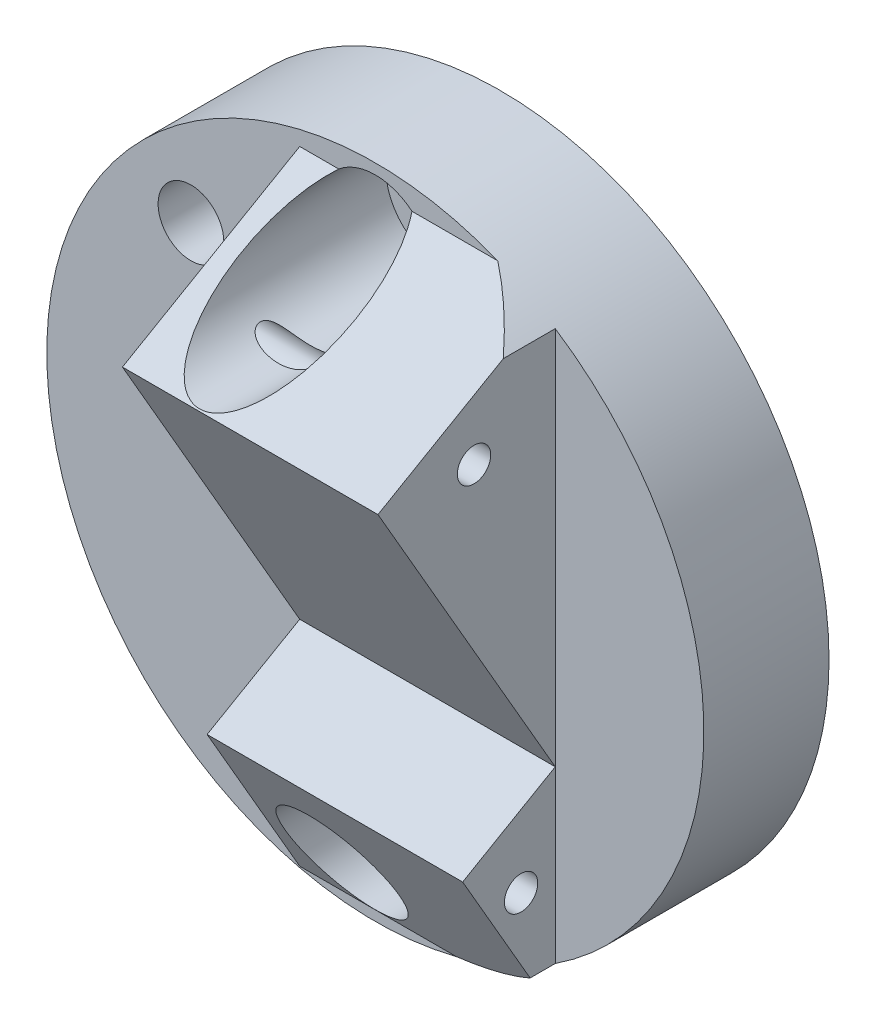
ISO-10303-21;
HEADER;
FILE_DESCRIPTION(('STEP AP214'),'2;1');
FILE_NAME('part.step','',(''),(''),'','','');
FILE_SCHEMA(('AUTOMOTIVE_DESIGN { 1 0 10303 214 1 1 1 1 }'));
ENDSEC;
DATA;
#1=APPLICATION_CONTEXT('core data for automotive mechanical design processes');
#2=APPLICATION_PROTOCOL_DEFINITION('international standard','automotive_design',2000,#1);
#3=PRODUCT_CONTEXT('',#1,'mechanical');
#4=PRODUCT('Part','Part','',(#3));
#5=PRODUCT_RELATED_PRODUCT_CATEGORY('part','',(#4));
#6=PRODUCT_DEFINITION_FORMATION('','',#4);
#7=PRODUCT_DEFINITION_CONTEXT('part definition',#1,'design');
#8=PRODUCT_DEFINITION('design','',#6,#7);
#9=PRODUCT_DEFINITION_SHAPE('','',#8);
#10=(LENGTH_UNIT() NAMED_UNIT(*) SI_UNIT(.MILLI.,.METRE.));
#11=(NAMED_UNIT(*) PLANE_ANGLE_UNIT() SI_UNIT($,.RADIAN.));
#12=(NAMED_UNIT(*) SI_UNIT($,.STERADIAN.) SOLID_ANGLE_UNIT());
#13=UNCERTAINTY_MEASURE_WITH_UNIT(LENGTH_MEASURE(1.E-05),#10,'distance_accuracy_value','');
#14=(GEOMETRIC_REPRESENTATION_CONTEXT(3) GLOBAL_UNCERTAINTY_ASSIGNED_CONTEXT((#13)) GLOBAL_UNIT_ASSIGNED_CONTEXT((#10,
#11,#12)) REPRESENTATION_CONTEXT('',''));
#15=CARTESIAN_POINT('',(0.,0.,0.));
#16=DIRECTION('',(0.,0.,1.));
#17=DIRECTION('',(1.,0.,0.));
#18=AXIS2_PLACEMENT_3D('',#15,#16,#17);
#19=CARTESIAN_POINT('',(-7.25,29.231895538638,12.));
#20=DIRECTION('',(0.,0.866025403784441,0.499999999999995));
#21=DIRECTION('',(0.,-0.499999999999995,0.866025403784442));
#22=AXIS2_PLACEMENT_3D('',#19,#20,#21);
#23=PLANE('',#22);
#24=DIRECTION('',(0.,-0.499999999999995,0.866025403784441));
#25=VECTOR('',#24,1.);
#26=CARTESIAN_POINT('',(17.25,29.231895538638,12.));
#27=LINE('',#26,#25);
#28=CARTESIAN_POINT('',(17.25,26.3569250862084,16.9795948938675));
#29=VERTEX_POINT('',#28);
#30=CARTESIAN_POINT('',(17.25,19.4178613164787,28.9984058999998));
#31=VERTEX_POINT('',#30);
#32=EDGE_CURVE('E165',#29,#31,#27,.T.);
#33=ORIENTED_EDGE('',*,*,#32,.F.);
#34=CARTESIAN_POINT('',(0.,0.,62.6311282744676));
#35=DIRECTION('',(0.,0.866025403784441,0.499999999999995));
#36=DIRECTION('',(0.,0.499999999999995,-0.866025403784442));
#37=AXIS2_PLACEMENT_3D('',#34,#35,#36);
#38=ELLIPSE('',#37,63.0000000000007,31.5);
#39=CARTESIAN_POINT('',(11.7365362530074,29.231895538638,12.));
#40=VERTEX_POINT('',#39);
#41=EDGE_CURVE('E48',#29,#40,#38,.T.);
#42=ORIENTED_EDGE('',*,*,#41,.T.);
#43=DIRECTION('',(1.,0.,0.));
#44=VECTOR('',#43,1.);
#45=CARTESIAN_POINT('',(-7.25,29.231895538638,12.));
#46=LINE('',#45,#44);
#47=CARTESIAN_POINT('',(3.51298450751723,29.231895538638,12.));
#48=VERTEX_POINT('',#47);
#49=EDGE_CURVE('E41',#48,#40,#46,.T.);
#50=ORIENTED_EDGE('',*,*,#49,.F.);
#51=CARTESIAN_POINT('',(0.,25.,19.3298580852451));
#52=DIRECTION('',(0.,0.866025403784441,0.499999999999995));
#53=DIRECTION('',(0.,0.499999999999995,-0.866025403784442));
#54=AXIS2_PLACEMENT_3D('',#51,#52,#53);
#55=ELLIPSE('',#54,11.0000000000001,5.5);
#56=CARTESIAN_POINT('',(-3.51298450751724,29.231895538638,12.));
#57=VERTEX_POINT('',#56);
#58=EDGE_CURVE('E11',#48,#57,#55,.F.);
#59=ORIENTED_EDGE('',*,*,#58,.T.);
#60=CARTESIAN_POINT('',(-7.25,29.231895538638,12.));
#61=VERTEX_POINT('',#60);
#62=EDGE_CURVE('E154',#61,#57,#46,.T.);
#63=ORIENTED_EDGE('',*,*,#62,.F.);
#64=DIRECTION('',(0.,-0.499999999999995,0.866025403784441));
#65=VECTOR('',#64,1.);
#66=CARTESIAN_POINT('',(-7.25,29.231895538638,12.));
#67=LINE('',#66,#65);
#68=CARTESIAN_POINT('',(-7.25,19.4178613164787,28.9984058999998));
#69=VERTEX_POINT('',#68);
#70=EDGE_CURVE('E171',#61,#69,#67,.T.);
#71=ORIENTED_EDGE('',*,*,#70,.T.);
#72=DIRECTION('',(1.,0.,0.));
#73=VECTOR('',#72,1.);
#74=CARTESIAN_POINT('',(-7.25,19.4178613164787,28.9984058999998));
#75=LINE('',#74,#73);
#76=EDGE_CURVE('E156',#69,#31,#75,.T.);
#77=ORIENTED_EDGE('',*,*,#76,.T.);
#78=EDGE_LOOP('',(#33,#42,#50,#59,#63,#71,#77));
#79=FACE_BOUND('',#78,.T.);
#80=ADVANCED_FACE('F32',(#79),#23,.T.);
#81=CARTESIAN_POINT('',(17.25,0.,0.));
#82=DIRECTION('',(1.,0.,0.));
#83=DIRECTION('',(0.,0.,-1.));
#84=AXIS2_PLACEMENT_3D('',#81,#82,#83);
#85=PLANE('',#84);
#86=CARTESIAN_POINT('',(17.25,18.9639258620637,19.7883031206711));
#87=DIRECTION('',(1.,0.,0.));
#88=DIRECTION('',(0.,0.,-1.));
#89=AXIS2_PLACEMENT_3D('',#86,#87,#88);
#90=CIRCLE('',#89,1.6);
#91=CARTESIAN_POINT('',(17.25,18.9639258620637,18.1883031206711));
#92=VERTEX_POINT('',#91);
#93=EDGE_CURVE('E191',#92,#92,#90,.T.);
#94=ORIENTED_EDGE('',*,*,#93,.F.);
#95=EDGE_LOOP('',(#94));
#96=FACE_BOUND('',#95,.T.);
#97=DIRECTION('',(0.,1.,0.));
#98=VECTOR('',#97,1.);
#99=CARTESIAN_POINT('',(17.25,-10.02424135,12.));
#100=LINE('',#99,#98);
#101=CARTESIAN_POINT('',(17.25,-10.02424135,12.));
#102=VERTEX_POINT('',#101);
#103=CARTESIAN_POINT('',(17.25,26.3569250862084,12.));
#104=VERTEX_POINT('',#103);
#105=EDGE_CURVE('E115',#102,#104,#100,.T.);
#106=ORIENTED_EDGE('',*,*,#105,.T.);
#107=DIRECTION('',(0.,0.,-1.));
#108=VECTOR('',#107,1.);
#109=CARTESIAN_POINT('',(17.25,26.3569250862084,82.));
#110=LINE('',#109,#108);
#111=EDGE_CURVE('E106',#104,#29,#110,.F.);
#112=ORIENTED_EDGE('',*,*,#111,.T.);
#113=ORIENTED_EDGE('',*,*,#32,.T.);
#114=DIRECTION('',(0.,-0.866025403784441,-0.499999999999995));
#115=VECTOR('',#114,1.);
#116=CARTESIAN_POINT('',(17.25,19.4178613164787,28.9984058999998));
#117=LINE('',#116,#115);
#118=EDGE_CURVE('E161',#31,#102,#117,.T.);
#119=ORIENTED_EDGE('',*,*,#118,.T.);
#120=EDGE_LOOP('',(#106,#112,#113,#119));
#121=FACE_BOUND('',#120,.T.);
#122=ADVANCED_FACE('F257',(#96,#121),#85,.T.);
#123=CARTESIAN_POINT('',(17.25,0.,0.));
#124=DIRECTION('',(1.,0.,0.));
#125=DIRECTION('',(0.,0.,-1.));
#126=AXIS2_PLACEMENT_3D('',#123,#124,#125);
#127=PLANE('',#126);
#128=CARTESIAN_POINT('',(17.25,-18.8469632703917,15.2786841774379));
#129=DIRECTION('',(1.,0.,0.));
#130=DIRECTION('',(0.,0.,-1.));
#131=AXIS2_PLACEMENT_3D('',#128,#129,#130);
#132=CIRCLE('',#131,1.6);
#133=CARTESIAN_POINT('',(17.25,-18.8469632703917,13.6786841774379));
#134=VERTEX_POINT('',#133);
#135=EDGE_CURVE('E202',#134,#134,#132,.T.);
#136=ORIENTED_EDGE('',*,*,#135,.F.);
#137=EDGE_LOOP('',(#136));
#138=FACE_BOUND('',#137,.T.);
#139=DIRECTION('',(0.,-0.866025403784438,-0.5));
#140=VECTOR('',#139,1.);
#141=CARTESIAN_POINT('',(17.25,-15.150011905,20.8780950292005));
#142=LINE('',#141,#140);
#143=CARTESIAN_POINT('',(17.25,-15.150011905,20.8780950292005));
#144=VERTEX_POINT('',#143);
#145=CARTESIAN_POINT('',(17.25,-26.3569250862084,14.4077806872451));
#146=VERTEX_POINT('',#145);
#147=EDGE_CURVE('E103',#144,#146,#142,.T.);
#148=ORIENTED_EDGE('',*,*,#147,.T.);
#149=DIRECTION('',(0.,0.,-1.));
#150=VECTOR('',#149,1.);
#151=CARTESIAN_POINT('',(17.25,-26.3569250862084,82.));
#152=LINE('',#151,#150);
#153=CARTESIAN_POINT('',(17.25,-26.3569250862084,12.));
#154=VERTEX_POINT('',#153);
#155=EDGE_CURVE('E96',#146,#154,#152,.T.);
#156=ORIENTED_EDGE('',*,*,#155,.T.);
#157=DIRECTION('',(0.,1.,0.));
#158=VECTOR('',#157,1.);
#159=CARTESIAN_POINT('',(17.25,-30.52732357,12.));
#160=LINE('',#159,#158);
#161=EDGE_CURVE('E100',#154,#102,#160,.T.);
#162=ORIENTED_EDGE('',*,*,#161,.T.);
#163=DIRECTION('',(0.,-0.5,0.866025403784439));
#164=VECTOR('',#163,1.);
#165=CARTESIAN_POINT('',(17.25,-10.02424135,12.));
#166=LINE('',#165,#164);
#167=EDGE_CURVE('E116',#102,#144,#166,.T.);
#168=ORIENTED_EDGE('',*,*,#167,.T.);
#169=EDGE_LOOP('',(#148,#156,#162,#168));
#170=FACE_BOUND('',#169,.T.);
#171=ADVANCED_FACE('F98',(#138,#170),#127,.T.);
#172=CARTESIAN_POINT('',(-29.5927158570214,-15.150011905,20.8780950292005));
#173=DIRECTION('',(0.,-0.5,0.866025403784439));
#174=DIRECTION('',(0.,-0.866025403784439,-0.5));
#175=AXIS2_PLACEMENT_3D('',#172,#173,#174);
#176=PLANE('',#175);
#177=CARTESIAN_POINT('',(0.,-25.,15.1912017510377));
#178=DIRECTION('',(0.,-0.5,0.866025403784439));
#179=DIRECTION('',(0.,-0.866025403784439,-0.5));
#180=AXIS2_PLACEMENT_3D('',#177,#178,#179);
#181=ELLIPSE('',#180,6.35085296108588,5.5);
#182=CARTESIAN_POINT('',(0.,-30.5,12.0157752704947));
#183=VERTEX_POINT('',#182);
#184=EDGE_CURVE('E36',#183,#183,#181,.F.);
#185=ORIENTED_EDGE('',*,*,#184,.T.);
#186=EDGE_LOOP('',(#185));
#187=FACE_BOUND('',#186,.T.);
#188=DIRECTION('',(1.,0.,0.));
#189=VECTOR('',#188,1.);
#190=CARTESIAN_POINT('',(-29.5927158570214,-30.52732357,12.));
#191=LINE('',#190,#189);
#192=CARTESIAN_POINT('',(-7.25,-30.52732357,12.));
#193=VERTEX_POINT('',#192);
#194=CARTESIAN_POINT('',(7.7674008299124,-30.52732357,12.));
#195=VERTEX_POINT('',#194);
#196=EDGE_CURVE('E180',#193,#195,#191,.T.);
#197=ORIENTED_EDGE('',*,*,#196,.T.);
#198=CARTESIAN_POINT('',(0.,0.,29.6249584807783));
#199=DIRECTION('',(0.,-0.5,0.866025403784439));
#200=DIRECTION('',(0.,-0.866025403784439,-0.5));
#201=AXIS2_PLACEMENT_3D('',#198,#199,#200);
#202=ELLIPSE('',#201,36.3730669589464,31.5);
#203=EDGE_CURVE('E107',#195,#146,#202,.T.);
#204=ORIENTED_EDGE('',*,*,#203,.T.);
#205=ORIENTED_EDGE('',*,*,#147,.F.);
#206=DIRECTION('',(1.,0.,0.));
#207=VECTOR('',#206,1.);
#208=CARTESIAN_POINT('',(-29.5927158570214,-15.150011905,20.8780950292005));
#209=LINE('',#208,#207);
#210=CARTESIAN_POINT('',(-7.25,-15.150011905,20.8780950292005));
#211=VERTEX_POINT('',#210);
#212=EDGE_CURVE('E178',#211,#144,#209,.T.);
#213=ORIENTED_EDGE('',*,*,#212,.F.);
#214=DIRECTION('',(0.,0.866025403784439,0.5));
#215=VECTOR('',#214,1.);
#216=CARTESIAN_POINT('',(-7.25,-15.150011905,20.8780950292005));
#217=LINE('',#216,#215);
#218=EDGE_CURVE('E183',#193,#211,#217,.T.);
#219=ORIENTED_EDGE('',*,*,#218,.F.);
#220=EDGE_LOOP('',(#197,#204,#205,#213,#219));
#221=FACE_BOUND('',#220,.T.);
#222=ADVANCED_FACE('F308',(#187,#221),#176,.T.);
#223=CARTESIAN_POINT('',(0.,0.,12.));
#224=DIRECTION('',(0.,0.,1.));
#225=DIRECTION('',(1.,0.,0.));
#226=AXIS2_PLACEMENT_3D('',#223,#224,#225);
#227=PLANE('',#226);
#228=ORIENTED_EDGE('',*,*,#161,.F.);
#229=CARTESIAN_POINT('',(0.,0.,12.));
#230=DIRECTION('',(0.,0.,1.));
#231=DIRECTION('',(1.,0.,0.));
#232=AXIS2_PLACEMENT_3D('',#229,#230,#231);
#233=CIRCLE('',#232,31.5);
#234=EDGE_CURVE('E113',#154,#104,#233,.T.);
#235=ORIENTED_EDGE('',*,*,#234,.T.);
#236=ORIENTED_EDGE('',*,*,#105,.F.);
#237=EDGE_LOOP('',(#228,#235,#236));
#238=FACE_BOUND('',#237,.T.);
#239=ADVANCED_FACE('F112',(#238),#227,.T.);
#240=CARTESIAN_POINT('',(0.,0.,12.));
#241=DIRECTION('',(0.,0.,-1.));
#242=DIRECTION('',(-1.,0.,0.));
#243=AXIS2_PLACEMENT_3D('',#240,#241,#242);
#244=CYLINDRICAL_SURFACE('',#243,31.5);
#245=EDGE_CURVE('E119',#40,#195,#233,.T.);
#246=ORIENTED_EDGE('',*,*,#245,.F.);
#247=ORIENTED_EDGE('',*,*,#41,.F.);
#248=ORIENTED_EDGE('',*,*,#111,.F.);
#249=ORIENTED_EDGE('',*,*,#234,.F.);
#250=ORIENTED_EDGE('',*,*,#155,.F.);
#251=ORIENTED_EDGE('',*,*,#203,.F.);
#252=EDGE_LOOP('',(#246,#247,#248,#249,#250,#251));
#253=FACE_BOUND('',#252,.T.);
#254=CARTESIAN_POINT('',(0.,0.,0.));
#255=DIRECTION('',(0.,0.,1.));
#256=DIRECTION('',(1.,0.,0.));
#257=AXIS2_PLACEMENT_3D('',#254,#255,#256);
#258=CIRCLE('',#257,31.5);
#259=CARTESIAN_POINT('',(31.5,0.,0.));
#260=VERTEX_POINT('',#259);
#261=EDGE_CURVE('E120',#260,#260,#258,.T.);
#262=ORIENTED_EDGE('',*,*,#261,.T.);
#263=EDGE_LOOP('',(#262));
#264=FACE_BOUND('',#263,.T.);
#265=ADVANCED_FACE('F34',(#253,#264),#244,.T.);
#266=ORIENTED_EDGE('',*,*,#196,.F.);
#267=DIRECTION('',(0.,-1.,0.));
#268=VECTOR('',#267,1.);
#269=CARTESIAN_POINT('',(-7.25,-30.52732357,12.));
#270=LINE('',#269,#268);
#271=CARTESIAN_POINT('',(-7.25,-10.02424135,12.));
#272=VERTEX_POINT('',#271);
#273=EDGE_CURVE('E177',#272,#193,#270,.T.);
#274=ORIENTED_EDGE('',*,*,#273,.F.);
#275=DIRECTION('',(0.,1.,0.));
#276=VECTOR('',#275,1.);
#277=CARTESIAN_POINT('',(-7.25,-10.02424135,12.));
#278=LINE('',#277,#276);
#279=EDGE_CURVE('E164',#272,#61,#278,.T.);
#280=ORIENTED_EDGE('',*,*,#279,.T.);
#281=ORIENTED_EDGE('',*,*,#62,.T.);
#282=CARTESIAN_POINT('',(0.,25.,12.));
#283=DIRECTION('',(0.,0.,1.));
#284=DIRECTION('',(1.,0.,0.));
#285=AXIS2_PLACEMENT_3D('',#282,#283,#284);
#286=CIRCLE('',#285,5.5);
#287=EDGE_CURVE('E144',#48,#57,#286,.T.);
#288=ORIENTED_EDGE('',*,*,#287,.F.);
#289=ORIENTED_EDGE('',*,*,#49,.T.);
#290=ORIENTED_EDGE('',*,*,#245,.T.);
#291=EDGE_LOOP('',(#266,#274,#280,#281,#288,#289,#290));
#292=FACE_BOUND('',#291,.T.);
#293=CARTESIAN_POINT('',(-17.6776695296637,17.6776695296637,12.));
#294=DIRECTION('',(0.,0.,1.));
#295=DIRECTION('',(1.,0.,0.));
#296=AXIS2_PLACEMENT_3D('',#293,#294,#295);
#297=CIRCLE('',#296,3.15);
#298=CARTESIAN_POINT('',(-14.5276695296637,17.6776695296637,12.));
#299=VERTEX_POINT('',#298);
#300=EDGE_CURVE('E147',#299,#299,#297,.F.);
#301=ORIENTED_EDGE('',*,*,#300,.T.);
#302=EDGE_LOOP('',(#301));
#303=FACE_BOUND('',#302,.T.);
#304=ADVANCED_FACE('F247',(#292,#303),#227,.T.);
#305=CARTESIAN_POINT('',(0.,0.,0.));
#306=DIRECTION('',(0.,0.,1.));
#307=DIRECTION('',(1.,0.,0.));
#308=AXIS2_PLACEMENT_3D('',#305,#306,#307);
#309=PLANE('',#308);
#310=CARTESIAN_POINT('',(-17.6776695296637,17.6776695296637,0.));
#311=DIRECTION('',(0.,0.,-1.));
#312=DIRECTION('',(-1.,0.,0.));
#313=AXIS2_PLACEMENT_3D('',#310,#311,#312);
#314=CIRCLE('',#313,3.15);
#315=CARTESIAN_POINT('',(-20.8276695296637,17.6776695296637,0.));
#316=VERTEX_POINT('',#315);
#317=EDGE_CURVE('E150',#316,#316,#314,.T.);
#318=ORIENTED_EDGE('',*,*,#317,.F.);
#319=EDGE_LOOP('',(#318));
#320=FACE_BOUND('',#319,.T.);
#321=CARTESIAN_POINT('',(0.,25.,0.));
#322=DIRECTION('',(0.,0.,1.));
#323=DIRECTION('',(1.,0.,0.));
#324=AXIS2_PLACEMENT_3D('',#321,#322,#323);
#325=CIRCLE('',#324,3.2);
#326=CARTESIAN_POINT('',(3.2,25.,0.));
#327=VERTEX_POINT('',#326);
#328=EDGE_CURVE('E135',#327,#327,#325,.T.);
#329=ORIENTED_EDGE('',*,*,#328,.T.);
#330=EDGE_LOOP('',(#329));
#331=FACE_BOUND('',#330,.T.);
#332=CARTESIAN_POINT('',(0.,-25.,0.));
#333=DIRECTION('',(0.,0.,1.));
#334=DIRECTION('',(1.,0.,0.));
#335=AXIS2_PLACEMENT_3D('',#332,#333,#334);
#336=CIRCLE('',#335,3.2);
#337=CARTESIAN_POINT('',(3.2,-25.,0.));
#338=VERTEX_POINT('',#337);
#339=EDGE_CURVE('E124',#338,#338,#336,.T.);
#340=ORIENTED_EDGE('',*,*,#339,.T.);
#341=EDGE_LOOP('',(#340));
#342=FACE_BOUND('',#341,.T.);
#343=ORIENTED_EDGE('',*,*,#261,.F.);
#344=EDGE_LOOP('',(#343));
#345=FACE_BOUND('',#344,.T.);
#346=ADVANCED_FACE('F245',(#320,#331,#342,#345),#309,.F.);
#347=CARTESIAN_POINT('',(0.,-25.,12.));
#348=DIRECTION('',(0.,0.,1.));
#349=DIRECTION('',(1.,0.,0.));
#350=AXIS2_PLACEMENT_3D('',#347,#348,#349);
#351=CYLINDRICAL_SURFACE('',#350,3.2);
#352=ORIENTED_EDGE('',*,*,#339,.F.);
#353=EDGE_LOOP('',(#352));
#354=FACE_BOUND('',#353,.T.);
#355=CARTESIAN_POINT('',(0.,-25.,5.5));
#356=DIRECTION('',(0.,0.,1.));
#357=DIRECTION('',(1.,0.,0.));
#358=AXIS2_PLACEMENT_3D('',#355,#356,#357);
#359=CIRCLE('',#358,3.2);
#360=CARTESIAN_POINT('',(3.2,-25.,5.5));
#361=VERTEX_POINT('',#360);
#362=EDGE_CURVE('E129',#361,#361,#359,.T.);
#363=ORIENTED_EDGE('',*,*,#362,.T.);
#364=EDGE_LOOP('',(#363));
#365=FACE_BOUND('',#364,.T.);
#366=ADVANCED_FACE('F241',(#354,#365),#351,.F.);
#367=CARTESIAN_POINT('',(3.2,-25.,5.5));
#368=DIRECTION('',(0.,0.,-1.));
#369=DIRECTION('',(-1.,0.,0.));
#370=AXIS2_PLACEMENT_3D('',#367,#368,#369);
#371=PLANE('',#370);
#372=ORIENTED_EDGE('',*,*,#362,.F.);
#373=EDGE_LOOP('',(#372));
#374=FACE_BOUND('',#373,.T.);
#375=CARTESIAN_POINT('',(0.,-25.,5.5));
#376=DIRECTION('',(0.,0.,1.));
#377=DIRECTION('',(1.,0.,0.));
#378=AXIS2_PLACEMENT_3D('',#375,#376,#377);
#379=CIRCLE('',#378,5.5);
#380=CARTESIAN_POINT('',(5.5,-25.,5.5));
#381=VERTEX_POINT('',#380);
#382=EDGE_CURVE('E132',#381,#381,#379,.T.);
#383=ORIENTED_EDGE('',*,*,#382,.T.);
#384=EDGE_LOOP('',(#383));
#385=FACE_BOUND('',#384,.T.);
#386=ADVANCED_FACE('F237',(#374,#385),#371,.F.);
#387=CARTESIAN_POINT('',(0.,-25.,12.));
#388=DIRECTION('',(0.,0.,1.));
#389=DIRECTION('',(1.,0.,0.));
#390=AXIS2_PLACEMENT_3D('',#387,#388,#389);
#391=CYLINDRICAL_SURFACE('',#390,5.5);
#392=CARTESIAN_POINT('',(0.,-19.5,13.8180189078493));
#393=CARTESIAN_POINT('',(-0.13598261566063,-19.4999997918411,13.8180213803917));
#394=CARTESIAN_POINT('',(-0.271957981193092,-19.5050467903192,13.8202447289082));
#395=CARTESIAN_POINT('',(-0.543087430273103,-19.5251901776175,13.8295001198357));
#396=CARTESIAN_POINT('',(-0.678241000400326,-19.5402923043802,13.8365349079492));
#397=CARTESIAN_POINT('',(-0.946497958076354,-19.5803592153536,13.8564913181114));
#398=CARTESIAN_POINT('',(-1.07960353447674,-19.605312581277,13.8694061274439));
#399=CARTESIAN_POINT('',(-1.34258951801343,-19.6646836513113,13.9030018475255));
#400=CARTESIAN_POINT('',(-1.47247291808295,-19.6990921843681,13.9236752398956));
#401=CARTESIAN_POINT('',(-1.71620532847653,-19.7732073559177,13.9733537586311));
#402=CARTESIAN_POINT('',(-1.83045415101767,-19.8121724334173,14.0014562577766));
#403=CARTESIAN_POINT('',(-1.99737216291166,-19.8751531525336,14.052492492892));
#404=CARTESIAN_POINT('',(-2.05226714007082,-19.8969014114272,14.0709841918343));
#405=CARTESIAN_POINT('',(-2.16024068967682,-19.9416627754405,14.1114042963919));
#406=CARTESIAN_POINT('',(-2.21331952556152,-19.9646756958436,14.1333322009762));
#407=CARTESIAN_POINT('',(-2.35135036995316,-20.0270696945623,14.196812296453));
#408=CARTESIAN_POINT('',(-2.43439560520452,-20.0672945706032,14.2418079825755));
#409=CARTESIAN_POINT('',(-2.59159436775736,-20.1480529047105,14.3451704273924));
#410=CARTESIAN_POINT('',(-2.66576703939908,-20.1885854900894,14.4035075765801));
#411=CARTESIAN_POINT('',(-2.77744343381123,-20.252535742517,14.5126273893567));
#412=CARTESIAN_POINT('',(-2.81870748574427,-20.276987514073,14.55893483826));
#413=CARTESIAN_POINT('',(-2.89414582640861,-20.3228365799412,14.6583740271729));
#414=CARTESIAN_POINT('',(-2.92832909742536,-20.3442377332109,14.7114969810753));
#415=CARTESIAN_POINT('',(-2.98294904504529,-20.3790807252444,14.8149109343638));
#416=CARTESIAN_POINT('',(-3.00471930523345,-20.3932517402386,14.8642459298625));
#417=CARTESIAN_POINT('',(-3.04097536545322,-20.4171032202796,14.9665731069628));
#418=CARTESIAN_POINT('',(-3.05546476265779,-20.4267859026422,15.019563467853));
#419=CARTESIAN_POINT('',(-3.07635061086573,-20.4408080460725,15.1281279001048));
#420=CARTESIAN_POINT('',(-3.0827036380864,-20.4451188340876,15.1837142070633));
#421=CARTESIAN_POINT('',(-3.0867348576246,-20.4478493417246,15.2953431088374));
#422=CARTESIAN_POINT('',(-3.08441517789344,-20.4462705064357,15.3513855883587));
#423=CARTESIAN_POINT('',(-3.07186655170504,-20.43779855208,15.4570088551646));
#424=CARTESIAN_POINT('',(-3.06236426878221,-20.4313938447268,15.5067189625671));
#425=CARTESIAN_POINT('',(-3.03683600432461,-20.4143854875509,15.6036629376362));
#426=CARTESIAN_POINT('',(-3.02080931189113,-20.4037813801655,15.6508965348294));
#427=CARTESIAN_POINT('',(-2.98192494094087,-20.37845411186,15.7445380265753));
#428=CARTESIAN_POINT('',(-2.95873698136113,-20.3635346995679,15.7907539689046));
#429=CARTESIAN_POINT('',(-2.90690639520226,-20.3308633433592,15.8788961710158));
#430=CARTESIAN_POINT('',(-2.87826094634305,-20.3131099346462,15.9208201939574));
#431=CARTESIAN_POINT('',(-2.79801073002515,-20.264555918423,16.0238959224327));
#432=CARTESIAN_POINT('',(-2.74289452720445,-20.2322832963573,16.0816235003521));
#433=CARTESIAN_POINT('',(-2.62426392790108,-20.1659663309036,16.1864864374445));
#434=CARTESIAN_POINT('',(-2.56072759625218,-20.1319175058586,16.2335932317503));
#435=CARTESIAN_POINT('',(-2.44151414915556,-20.0712559238545,16.3096783969048));
#436=CARTESIAN_POINT('',(-2.38695349695515,-20.0445704025944,16.340389265505));
#437=CARTESIAN_POINT('',(-2.2748413093755,-19.9921134233847,16.3967699749108));
#438=CARTESIAN_POINT('',(-2.21728798454847,-19.9663425281896,16.4224367547681));
#439=CARTESIAN_POINT('',(-2.09975926041764,-19.9161922210065,16.4694538450177));
#440=CARTESIAN_POINT('',(-2.03978021628182,-19.8918150466874,16.4907973465934));
#441=CARTESIAN_POINT('',(-1.91793993360366,-19.8448301792043,16.5297600736811));
#442=CARTESIAN_POINT('',(-1.856078046234,-19.8222231058276,16.5473779983511));
#443=CARTESIAN_POINT('',(-1.68803681114737,-19.7642624037965,16.590410756769));
#444=CARTESIAN_POINT('',(-1.58046888122683,-19.7307589146592,16.6129232639846));
#445=CARTESIAN_POINT('',(-1.36233217692576,-19.6701882046855,16.6511184615164));
#446=CARTESIAN_POINT('',(-1.25176146528056,-19.6431252544595,16.6667966257953));
#447=CARTESIAN_POINT('',(-1.02843875444859,-19.5958019842562,16.6928873505538));
#448=CARTESIAN_POINT('',(-0.915684365002131,-19.5755496229653,16.7032937577268));
#449=CARTESIAN_POINT('',(-0.688864504862052,-19.5421058262057,16.7199071111789));
#450=CARTESIAN_POINT('',(-0.574799315527622,-19.5289129033348,16.7261149421579));
#451=CARTESIAN_POINT('',(-0.339444264991726,-19.5091437940211,16.7352703903139));
#452=CARTESIAN_POINT('',(-0.218111372775532,-19.5029850494103,16.7380132647323));
#453=CARTESIAN_POINT('',(0.0247404212094944,-19.4987147330278,16.739925094308));
#454=CARTESIAN_POINT('',(0.146259348424519,-19.5006043832743,16.7390935067412));
#455=CARTESIAN_POINT('',(0.388768638061667,-19.5124149097062,16.7337498199341));
#456=CARTESIAN_POINT('',(0.509759223499841,-19.5223319829654,16.729239463473));
#457=CARTESIAN_POINT('',(0.75057611824677,-19.5501085991777,16.71598259909));
#458=CARTESIAN_POINT('',(0.870402724099715,-19.567966061901,16.7072372006145));
#459=CARTESIAN_POINT('',(1.07853200994686,-19.6060210479515,16.6872884194217));
#460=CARTESIAN_POINT('',(1.16725701702262,-19.6245296092719,16.6772387562054));
#461=CARTESIAN_POINT('',(1.34321842811588,-19.6657779095652,16.6534971856031));
#462=CARTESIAN_POINT('',(1.43045512008685,-19.6885168196948,16.639805991469));
#463=CARTESIAN_POINT('',(1.60284363665598,-19.7379738916579,16.6079566454412));
#464=CARTESIAN_POINT('',(1.68799821230954,-19.7646864308862,16.5898047820175));
#465=CARTESIAN_POINT('',(1.85565963574033,-19.8217412205211,16.5479588037295));
#466=CARTESIAN_POINT('',(1.93816781495797,-19.8520816081886,16.5242675271876));
#467=CARTESIAN_POINT('',(2.11567104952594,-19.9221334477921,16.4646584515017));
#468=CARTESIAN_POINT('',(2.20991758209126,-19.9625126945051,16.4272505445124));
#469=CARTESIAN_POINT('',(2.39115740008169,-20.0459854585812,16.3398142266759));
#470=CARTESIAN_POINT('',(2.47815974819032,-20.08907546246,16.2898019097693));
#471=CARTESIAN_POINT('',(2.61894230928593,-20.1630956478785,16.1900088009837));
#472=CARTESIAN_POINT('',(2.67528265434585,-20.1941139383168,16.1439398070627));
#473=CARTESIAN_POINT('',(2.78026191593778,-20.2540781955405,16.0425452042353));
#474=CARTESIAN_POINT('',(2.82891341523225,-20.2830275047593,15.9872350302128));
#475=CARTESIAN_POINT('',(2.90547277487713,-20.329909337051,15.8814799381895));
#476=CARTESIAN_POINT('',(2.93555662452025,-20.3488182346765,15.8330545340673));
#477=CARTESIAN_POINT('',(2.98844560483124,-20.3826221368852,15.7310460269499));
#478=CARTESIAN_POINT('',(3.01125439648904,-20.3975191597541,15.677465535849));
#479=CARTESIAN_POINT('',(3.04842732875338,-20.4220528776322,15.5657164756753));
#480=CARTESIAN_POINT('',(3.06271676811492,-20.4316429883835,15.5075122501278));
#481=CARTESIAN_POINT('',(3.08148064417733,-20.4442768856323,15.3888523359356));
#482=CARTESIAN_POINT('',(3.08596310232597,-20.4473260221648,15.3283985284937));
#483=CARTESIAN_POINT('',(3.0848653477681,-20.4465837931188,15.2158807194853));
#484=CARTESIAN_POINT('',(3.08056904485563,-20.4436651794523,15.1637923068014));
#485=CARTESIAN_POINT('',(3.06467627427035,-20.4329604456626,15.0612711596749));
#486=CARTESIAN_POINT('',(3.05308005493969,-20.4251744911257,15.0108383689696));
#487=CARTESIAN_POINT('',(3.0233513243453,-20.4054753786244,14.9133105386205));
#488=CARTESIAN_POINT('',(3.00527540509826,-20.3935979882298,14.8661906998148));
#489=CARTESIAN_POINT('',(2.96340719784583,-20.3665520136527,14.7756047797231));
#490=CARTESIAN_POINT('',(2.93961257481609,-20.351382085328,14.7321402007408));
#491=CARTESIAN_POINT('',(2.87448911021142,-20.3107150087954,14.6292236116444));
#492=CARTESIAN_POINT('',(2.83024193395911,-20.2837685281081,14.5721879018845));
#493=CARTESIAN_POINT('',(2.73364658530273,-20.2271248408106,14.467057280776));
#494=CARTESIAN_POINT('',(2.68128030688589,-20.1974215472866,14.4189828946085));
#495=CARTESIAN_POINT('',(2.54183212248124,-20.1216637808883,14.308271256858));
#496=CARTESIAN_POINT('',(2.45081191332061,-20.0751045290137,14.250977792976));
#497=CARTESIAN_POINT('',(2.25972623464011,-19.9845317535756,14.1515315296376));
#498=CARTESIAN_POINT('',(2.15963842666959,-19.9405249805698,14.1094174684985));
#499=CARTESIAN_POINT('',(1.96901914145427,-19.8636690546136,14.042364429896));
#500=CARTESIAN_POINT('',(1.8793178464992,-19.8301375861618,14.0157941912954));
#501=CARTESIAN_POINT('',(1.69669895284916,-19.7673577221167,13.9693327383285));
#502=CARTESIAN_POINT('',(1.60377906243049,-19.7381124592759,13.9494463955729));
#503=CARTESIAN_POINT('',(1.41558371226308,-19.6843902734027,13.9149636700721));
#504=CARTESIAN_POINT('',(1.32030720266341,-19.6599155203268,13.9003696920737));
#505=CARTESIAN_POINT('',(1.12809944196232,-19.6160318455555,13.8754145613491));
#506=CARTESIAN_POINT('',(1.03116869825523,-19.5966213992415,13.8650521341747));
#507=CARTESIAN_POINT('',(0.779995244026093,-19.5533596990643,13.8427478594425));
#508=CARTESIAN_POINT('',(0.62484786274835,-19.5333732143816,13.8333243011437));
#509=CARTESIAN_POINT('',(0.313130812139037,-19.5066908358618,13.8209571105683));
#510=CARTESIAN_POINT('',(0.156560600842992,-19.5000002396592,13.8180160611418));
#511=CARTESIAN_POINT('',(0.,-19.5,13.8180189078493));
#512=B_SPLINE_CURVE_WITH_KNOTS('',3,(#392,#393,#394,#395,#396,#397,#398,#399,#400,#401,#402,
#403,#404,#405,#406,#407,#408,#409,#410,#411,#412,#413,#414,#415,#416,#417,#418,#419,#420,#421,
#422,#423,#424,#425,#426,#427,#428,#429,#430,#431,#432,#433,#434,#435,#436,#437,#438,#439,#440,
#441,#442,#443,#444,#445,#446,#447,#448,#449,#450,#451,#452,#453,#454,#455,#456,#457,#458,#459,
#460,#461,#462,#463,#464,#465,#466,#467,#468,#469,#470,#471,#472,#473,#474,#475,#476,#477,#478,
#479,#480,#481,#482,#483,#484,#485,#486,#487,#488,#489,#490,#491,#492,#493,#494,#495,#496,#497,
#498,#499,#500,#501,#502,#503,#504,#505,#506,#507,#508,#509,#510,#511),.UNSPECIFIED.,.T.,.F.,(4,
2,2,2,2,2,2,2,2,2,2,2,2,2,2,2,2,2,2,2,2,2,2,2,2,2,2,2,2,2,2,2,2,2,2,2,2,2,2,2,2,2,2,2,2,2,2,2,2,
2,2,2,2,2,2,2,2,2,2,4),(0.,0.407821833009039,0.815876588564412,1.22345976171272,1.6306489859476,
2.00168827299958,2.1871950739045,2.37267485130896,2.67970076174416,2.98605177252921,
3.1854289635057,3.38455166546901,3.55113243139046,3.71763081553372,3.88501414786364,
4.05235641340706,4.20471746647185,4.35709512522026,4.51794566125627,4.67887960626748,
4.93568694512229,5.19317694636827,5.39707653794487,5.60109948417527,5.80544129375682,
6.00985433502101,6.35399509022247,6.69836340735592,7.04313275766593,7.38782943749071,
7.75206443152589,8.11635473070826,8.48047255126237,8.8444950360801,9.11790488508396,
9.39126122178565,9.6642343806188,9.93706797692039,10.2637365843658,10.5899901797,
10.8266043837848,11.0628272679351,11.2423423984835,11.4217670495093,11.6027426763936,
11.7835702220209,11.9398400995917,12.0961046611702,12.251036432342,12.4060315720558,
12.6358799526186,12.8662484816883,13.2158683873694,13.5663743201431,13.8641053273649,
14.1620528699932,14.4601356250158,14.7581285378708,15.2274782859973,15.6970150051036),.UNSPECIFIED.);
#513=CARTESIAN_POINT('',(0.,-19.5,13.8180189078493));
#514=VERTEX_POINT('',#513);
#515=EDGE_CURVE('E221',#514,#514,#512,.T.);
#516=ORIENTED_EDGE('',*,*,#515,.T.);
#517=EDGE_LOOP('',(#516));
#518=FACE_BOUND('',#517,.T.);
#519=ORIENTED_EDGE('',*,*,#382,.F.);
#520=EDGE_LOOP('',(#519));
#521=FACE_BOUND('',#520,.T.);
#522=ORIENTED_EDGE('',*,*,#184,.F.);
#523=EDGE_LOOP('',(#522));
#524=FACE_BOUND('',#523,.T.);
#525=ADVANCED_FACE('F231',(#518,#521,#524),#391,.F.);
#526=CARTESIAN_POINT('',(0.,25.,12.));
#527=DIRECTION('',(0.,0.,1.));
#528=DIRECTION('',(1.,0.,0.));
#529=AXIS2_PLACEMENT_3D('',#526,#527,#528);
#530=CYLINDRICAL_SURFACE('',#529,3.2);
#531=ORIENTED_EDGE('',*,*,#328,.F.);
#532=EDGE_LOOP('',(#531));
#533=FACE_BOUND('',#532,.T.);
#534=CARTESIAN_POINT('',(0.,25.,5.5));
#535=DIRECTION('',(0.,0.,1.));
#536=DIRECTION('',(1.,0.,0.));
#537=AXIS2_PLACEMENT_3D('',#534,#535,#536);
#538=CIRCLE('',#537,3.2);
#539=CARTESIAN_POINT('',(3.2,25.,5.5));
#540=VERTEX_POINT('',#539);
#541=EDGE_CURVE('E138',#540,#540,#538,.T.);
#542=ORIENTED_EDGE('',*,*,#541,.T.);
#543=EDGE_LOOP('',(#542));
#544=FACE_BOUND('',#543,.T.);
#545=ADVANCED_FACE('F236',(#533,#544),#530,.F.);
#546=CARTESIAN_POINT('',(3.2,25.,5.5));
#547=DIRECTION('',(0.,0.,-1.));
#548=DIRECTION('',(-1.,0.,0.));
#549=AXIS2_PLACEMENT_3D('',#546,#547,#548);
#550=PLANE('',#549);
#551=ORIENTED_EDGE('',*,*,#541,.F.);
#552=EDGE_LOOP('',(#551));
#553=FACE_BOUND('',#552,.T.);
#554=CARTESIAN_POINT('',(0.,25.,5.5));
#555=DIRECTION('',(0.,0.,1.));
#556=DIRECTION('',(1.,0.,0.));
#557=AXIS2_PLACEMENT_3D('',#554,#555,#556);
#558=CIRCLE('',#557,5.5);
#559=CARTESIAN_POINT('',(5.5,25.,5.5));
#560=VERTEX_POINT('',#559);
#561=EDGE_CURVE('E141',#560,#560,#558,.T.);
#562=ORIENTED_EDGE('',*,*,#561,.T.);
#563=EDGE_LOOP('',(#562));
#564=FACE_BOUND('',#563,.T.);
#565=ADVANCED_FACE('F278',(#553,#564),#550,.F.);
#566=CARTESIAN_POINT('',(0.,25.,12.));
#567=DIRECTION('',(0.,0.,1.));
#568=DIRECTION('',(1.,0.,0.));
#569=AXIS2_PLACEMENT_3D('',#566,#567,#568);
#570=CYLINDRICAL_SURFACE('',#569,5.5);
#571=CARTESIAN_POINT('',(0.,19.5,18.2807804778442));
#572=CARTESIAN_POINT('',(0.135802959379061,19.5000005011445,18.2807785043406));
#573=CARTESIAN_POINT('',(0.271615612237563,19.5050338095492,18.2825415985893));
#574=CARTESIAN_POINT('',(0.542437516143692,19.5251294775411,18.2899159744413));
#575=CARTESIAN_POINT('',(0.677446481402423,19.5401952120714,18.295528551043));
#576=CARTESIAN_POINT('',(0.945512773047963,19.580190671178,18.3115891363953));
#577=CARTESIAN_POINT('',(1.07857276938592,19.6051052686713,18.3220297338399));
#578=CARTESIAN_POINT('',(1.34177650556127,19.6644749170606,18.3494491893736));
#579=CARTESIAN_POINT('',(1.47192227535437,19.6989230886229,18.3664233363562));
#580=CARTESIAN_POINT('',(1.73096530468638,19.7776973225545,18.4099476778972));
#581=CARTESIAN_POINT('',(1.85976826269291,19.8222285771605,18.4367051415391));
#582=CARTESIAN_POINT('',(2.04793625390591,19.8950514430392,18.4868194658651));
#583=CARTESIAN_POINT('',(2.10981502802095,19.9203279264399,18.5051854988386));
#584=CARTESIAN_POINT('',(2.23151030937307,19.9726005730805,18.5458567923347));
#585=CARTESIAN_POINT('',(2.29132723784587,19.9995963818137,18.5681612424676));
#586=CARTESIAN_POINT('',(2.44111771649737,20.0703861801432,18.631111264925));
#587=CARTESIAN_POINT('',(2.52930152627871,20.1151508367519,18.6750477587856));
#588=CARTESIAN_POINT('',(2.69674496512889,20.2055703514448,18.7768995009573));
#589=CARTESIAN_POINT('',(2.77602258665192,20.2512231879021,18.8347857949366));
#590=CARTESIAN_POINT('',(2.89738640793537,20.3247016205026,18.9450406382115));
#591=CARTESIAN_POINT('',(2.94307136406261,20.3534053449681,18.9928382991798));
#592=CARTESIAN_POINT('',(3.02701494758499,20.407651562393,19.0961697371057));
#593=CARTESIAN_POINT('',(3.0652831534903,20.4331981170735,19.1516933747315));
#594=CARTESIAN_POINT('',(3.1266551144588,20.4750503747309,19.2598562872357));
#595=CARTESIAN_POINT('',(3.15123767561026,20.4921903030637,19.3113269251627));
#596=CARTESIAN_POINT('',(3.19290467353876,20.5216059459075,19.4185524436375));
#597=CARTESIAN_POINT('',(3.2099926185031,20.5338839360021,19.4743053053077));
#598=CARTESIAN_POINT('',(3.23579372547541,20.5525399862215,19.5890546599501));
#599=CARTESIAN_POINT('',(3.24445726287456,20.558883078209,19.6480682344665));
#600=CARTESIAN_POINT('',(3.25266743844209,20.5648919013733,19.7670618517473));
#601=CARTESIAN_POINT('',(3.25221732513277,20.5645600118193,19.8270415425267));
#602=CARTESIAN_POINT('',(3.24274271805978,20.5576308071317,19.9399086919218));
#603=CARTESIAN_POINT('',(3.23457167082273,20.5516571471639,19.9929103259615));
#604=CARTESIAN_POINT('',(3.21130381087657,20.5348312393968,20.0965452451441));
#605=CARTESIAN_POINT('',(3.19620671703795,20.523978793567,20.1471784340595));
#606=CARTESIAN_POINT('',(3.15914785711886,20.4977436170715,20.2467205737493));
#607=CARTESIAN_POINT('',(3.13696537550158,20.4822163050333,20.295508104589));
#608=CARTESIAN_POINT('',(3.08684977413715,20.4478264190649,20.3887303883071));
#609=CARTESIAN_POINT('',(3.05891384358682,20.4289622155602,20.4331629979036));
#610=CARTESIAN_POINT('',(2.98204817944467,20.378261639475,20.5398066501084));
#611=CARTESIAN_POINT('',(2.92985045731778,20.3448583573209,20.5989200256313));
#612=CARTESIAN_POINT('',(2.81692817947866,20.2756674912299,20.7067050606109));
#613=CARTESIAN_POINT('',(2.75618328607904,20.2398743306383,20.755351093979));
#614=CARTESIAN_POINT('',(2.64308842782015,20.1763823098626,20.833222651877));
#615=CARTESIAN_POINT('',(2.592000132048,20.1487062794792,20.864344634394));
#616=CARTESIAN_POINT('',(2.48681867465067,20.0939580428154,20.9217055725628));
#617=CARTESIAN_POINT('',(2.43272383697207,20.0668861853697,20.9479417683592));
#618=CARTESIAN_POINT('',(2.32206195171531,20.0138390352768,20.9961812545886));
#619=CARTESIAN_POINT('',(2.2654911571271,19.9878655304417,21.0181778366045));
#620=CARTESIAN_POINT('',(2.15039320251652,19.9374153505873,21.0584837564751));
#621=CARTESIAN_POINT('',(2.09186535620341,19.9129392093543,21.0767917846917));
#622=CARTESIAN_POINT('',(1.93227052637997,19.8494704811536,21.1217994709163));
#623=CARTESIAN_POINT('',(1.82971966689473,19.8121161595056,21.1455715678729));
#624=CARTESIAN_POINT('',(1.6213289393307,19.7432553859694,21.1862441433639));
#625=CARTESIAN_POINT('',(1.51548687292477,19.7117529451765,21.2031399179909));
#626=CARTESIAN_POINT('',(1.3013315552463,19.6550192308595,21.2317014312642));
#627=CARTESIAN_POINT('',(1.19301572049831,19.6297948745943,21.2433614123299));
#628=CARTESIAN_POINT('',(0.974745044077584,19.5859196476294,21.2626491056221));
#629=CARTESIAN_POINT('',(0.864790545353522,19.5672674210681,21.2702776497158));
#630=CARTESIAN_POINT('',(0.636359634196271,19.5356410315297,21.2827766513299));
#631=CARTESIAN_POINT('',(0.517806841011174,19.5231323440641,21.2874274644496));
#632=CARTESIAN_POINT('',(0.280052702565389,19.5058412614156,21.2937637070446));
#633=CARTESIAN_POINT('',(0.16085128984039,19.5010596859783,21.2954488218999));
#634=CARTESIAN_POINT('',(-0.0776427224670139,19.4992550305726,21.2960907735788));
#635=CARTESIAN_POINT('',(-0.196935336027548,19.5022335963657,21.2950470316696));
#636=CARTESIAN_POINT('',(-0.435006573213154,19.5159337048668,21.2900824258827));
#637=CARTESIAN_POINT('',(-0.553785247594914,19.5266544645457,21.2861618529609));
#638=CARTESIAN_POINT('',(-0.784600327515786,19.5550692827181,21.2751688274469));
#639=CARTESIAN_POINT('',(-0.896688151413892,19.5724064406579,21.2682555876414));
#640=CARTESIAN_POINT('',(-1.11931516293468,19.6139109934495,21.250503616977));
#641=CARTESIAN_POINT('',(-1.22985400336,19.6380798946924,21.2396640202126));
#642=CARTESIAN_POINT('',(-1.44844152430136,19.6929589029989,21.2128883319641));
#643=CARTESIAN_POINT('',(-1.55649488268491,19.7236553763845,21.1969628287903));
#644=CARTESIAN_POINT('',(-1.76938879273324,19.7911885543009,21.1583941631855));
#645=CARTESIAN_POINT('',(-1.87423161257496,19.828020799756,21.1357558699172));
#646=CARTESIAN_POINT('',(-2.08294507856437,19.9084142647924,21.0807422753485));
#647=CARTESIAN_POINT('',(-2.18667003291782,19.9521571226838,21.0480708954087));
#648=CARTESIAN_POINT('',(-2.38744185405236,20.0439686014568,20.9703057396532));
#649=CARTESIAN_POINT('',(-2.4844934833092,20.0920340797189,20.9252209402244));
#650=CARTESIAN_POINT('',(-2.64934330524101,20.1794415213073,20.8302983461787));
#651=CARTESIAN_POINT('',(-2.71899951263696,20.2184905351476,20.7834576541756));
#652=CARTESIAN_POINT('',(-2.84975982364619,20.2952604905157,20.6781220257738));
#653=CARTESIAN_POINT('',(-2.91088060816695,20.3329839114909,20.6196503782017));
#654=CARTESIAN_POINT('',(-3.00555357282707,20.3936058515251,20.508572922328));
#655=CARTESIAN_POINT('',(-3.04199114142325,20.4176588533094,20.4590714722991));
#656=CARTESIAN_POINT('',(-3.10743212785253,20.4617823119161,20.3537061879433));
#657=CARTESIAN_POINT('',(-3.13643855902001,20.4818543822626,20.2978449458339));
#658=CARTESIAN_POINT('',(-3.18571719828691,20.5164598375066,20.1800161410611));
#659=CARTESIAN_POINT('',(-3.20589942205465,20.5309359932238,20.1179932398557));
#660=CARTESIAN_POINT('',(-3.23568294435844,20.5524493696804,19.9902214028599));
#661=CARTESIAN_POINT('',(-3.2452961055851,20.5594949301395,19.92447673174));
#662=CARTESIAN_POINT('',(-3.25262508152992,20.5648629418678,19.8019422896133));
#663=CARTESIAN_POINT('',(-3.25191102076991,20.5643366680214,19.7452907146434));
#664=CARTESIAN_POINT('',(-3.24238355215146,20.5573674349366,19.6330556377602));
#665=CARTESIAN_POINT('',(-3.23357168090101,20.5509255982119,19.5774719352544));
#666=CARTESIAN_POINT('',(-3.20896196110624,20.5331469964947,19.4716153787513));
#667=CARTESIAN_POINT('',(-3.19352008329331,20.5220602702912,19.421215670079));
#668=CARTESIAN_POINT('',(-3.1564716671071,20.4958684334152,19.3238713213754));
#669=CARTESIAN_POINT('',(-3.13486320656866,20.4807620698943,19.2769277643982));
#670=CARTESIAN_POINT('',(-3.0768674881025,20.4409934239821,19.1696857827541));
#671=CARTESIAN_POINT('',(-3.03799800395259,20.4148964420887,19.1112601894177));
#672=CARTESIAN_POINT('',(-2.95210780213643,20.3591275933737,19.00271033189));
#673=CARTESIAN_POINT('',(-2.90507117455795,20.3294487840796,18.9526026510807));
#674=CARTESIAN_POINT('',(-2.78193312722046,20.2546787013248,18.8393924931795));
#675=CARTESIAN_POINT('',(-2.70232832950768,20.2087049402995,18.7807113101297));
#676=CARTESIAN_POINT('',(-2.53403469542771,20.1175934655083,18.6775338703751));
#677=CARTESIAN_POINT('',(-2.44532667417201,20.0724577643807,18.6330684191454));
#678=CARTESIAN_POINT('',(-2.27709497108067,19.9928044059602,18.5620303562175));
#679=CARTESIAN_POINT('',(-2.19852967090506,19.9577763106414,18.5337070767834));
#680=CARTESIAN_POINT('',(-2.03807079609808,19.890809182612,18.4834496551893));
#681=CARTESIAN_POINT('',(-1.95617500563249,19.8588722558893,18.4615198486662));
#682=CARTESIAN_POINT('',(-1.78977317053178,19.7986003794328,18.422798982048));
#683=CARTESIAN_POINT('',(-1.70526369880347,19.770270431704,18.406015013558));
#684=CARTESIAN_POINT('',(-1.53429968402811,19.717582827927,18.3765985276557));
#685=CARTESIAN_POINT('',(-1.44784466667298,19.6932261527344,18.3639670345587));
#686=CARTESIAN_POINT('',(-1.25027562041505,19.642782242091,18.3391151854669));
#687=CARTESIAN_POINT('',(-1.13871337901491,19.6179548327433,18.3278958967385));
#688=CARTESIAN_POINT('',(-0.913930010480024,19.5752577112645,18.309516238321));
#689=CARTESIAN_POINT('',(-0.800708541044136,19.5573894563958,18.3023567186134));
#690=CARTESIAN_POINT('',(-0.573158250430551,19.5287436742406,18.2912335684271));
#691=CARTESIAN_POINT('',(-0.458828872045711,19.5179699252898,18.2872716406434));
#692=CARTESIAN_POINT('',(-0.229668629604229,19.5035979831017,18.2820459699371));
#693=CARTESIAN_POINT('',(-0.114837780580674,19.4999995762219,18.2807821466795));
#694=CARTESIAN_POINT('',(0.,19.5,18.2807804778442));
#695=B_SPLINE_CURVE_WITH_KNOTS('',3,(#571,#572,#573,#574,#575,#576,#577,#578,#579,#580,#581,
#582,#583,#584,#585,#586,#587,#588,#589,#590,#591,#592,#593,#594,#595,#596,#597,#598,#599,#600,
#601,#602,#603,#604,#605,#606,#607,#608,#609,#610,#611,#612,#613,#614,#615,#616,#617,#618,#619,
#620,#621,#622,#623,#624,#625,#626,#627,#628,#629,#630,#631,#632,#633,#634,#635,#636,#637,#638,
#639,#640,#641,#642,#643,#644,#645,#646,#647,#648,#649,#650,#651,#652,#653,#654,#655,#656,#657,
#658,#659,#660,#661,#662,#663,#664,#665,#666,#667,#668,#669,#670,#671,#672,#673,#674,#675,#676,
#677,#678,#679,#680,#681,#682,#683,#684,#685,#686,#687,#688,#689,#690,#691,#692,#693,#694),
.UNSPECIFIED.,.T.,.F.,(4,2,2,2,2,2,2,2,2,2,2,2,2,2,2,2,2,2,2,2,2,2,2,2,2,2,2,2,2,2,2,2,2,2,2,2,
2,2,2,2,2,2,2,2,2,2,2,2,2,2,2,2,2,2,2,2,2,2,2,2,2,4),(0.,0.407319480685171,0.814776054334614,
1.22160922309036,1.6281495870358,2.0438556185002,2.25167725405796,2.45945617685836,
2.78313199342633,3.10614168588965,3.32169340294643,3.5369648588087,3.71491711936996,
3.8927859923536,4.07169638015039,4.2505429972181,4.41168026291434,4.57282406978046,
4.73957867822602,4.90641494742774,5.16189657054552,5.41799671981979,5.61546859646493,
5.81305168376853,6.01094488888899,6.20890823356566,6.54348192818789,6.87828411253743,
7.2134535684449,7.54855383675809,7.90615970668477,8.26380351142912,8.62152317102313,
8.9792066566742,9.31983394710102,9.66053640410463,10.000534129235,10.3402858357486,
10.6912250545713,11.0419111658485,11.3187944249165,11.5951287585084,11.7924390736562,
11.9896692521601,12.1888662573805,12.3878394553842,12.5569265173426,12.7259815006427,
12.8869144786611,13.047897675462,13.271254687931,13.4950517927679,13.8204041338167,
14.1464568078655,14.4177697204559,14.689266194095,14.9611351590505,15.2330711372739,
15.5772639047423,15.9215287082342,16.2659767095832,16.6104144549979),.UNSPECIFIED.);
#696=CARTESIAN_POINT('',(0.,19.5,18.2807804778442));
#697=VERTEX_POINT('',#696);
#698=EDGE_CURVE('E194',#697,#697,#695,.T.);
#699=ORIENTED_EDGE('',*,*,#698,.T.);
#700=EDGE_LOOP('',(#699));
#701=FACE_BOUND('',#700,.T.);
#702=ORIENTED_EDGE('',*,*,#561,.F.);
#703=EDGE_LOOP('',(#702));
#704=FACE_BOUND('',#703,.T.);
#705=ORIENTED_EDGE('',*,*,#287,.T.);
#706=ORIENTED_EDGE('',*,*,#58,.F.);
#707=EDGE_LOOP('',(#705,#706));
#708=FACE_BOUND('',#707,.T.);
#709=ADVANCED_FACE('F204',(#701,#704,#708),#570,.F.);
#710=CARTESIAN_POINT('',(-17.6776695296637,17.6776695296637,20.9095454429505));
#711=DIRECTION('',(0.,0.,-1.));
#712=DIRECTION('',(-1.,0.,0.));
#713=AXIS2_PLACEMENT_3D('',#710,#711,#712);
#714=CYLINDRICAL_SURFACE('',#713,3.15);
#715=ORIENTED_EDGE('',*,*,#317,.T.);
#716=EDGE_LOOP('',(#715));
#717=FACE_BOUND('',#716,.T.);
#718=ORIENTED_EDGE('',*,*,#300,.F.);
#719=EDGE_LOOP('',(#718));
#720=FACE_BOUND('',#719,.T.);
#721=ADVANCED_FACE('F268',(#717,#720),#714,.F.);
#722=CARTESIAN_POINT('',(-7.25,19.4178613164787,28.9984058999998));
#723=DIRECTION('',(0.,-0.499999999999995,0.866025403784441));
#724=DIRECTION('',(0.,-0.866025403784442,-0.499999999999995));
#725=AXIS2_PLACEMENT_3D('',#722,#723,#724);
#726=PLANE('',#725);
#727=ORIENTED_EDGE('',*,*,#118,.F.);
#728=ORIENTED_EDGE('',*,*,#76,.F.);
#729=DIRECTION('',(0.,-0.866025403784441,-0.499999999999995));
#730=VECTOR('',#729,1.);
#731=CARTESIAN_POINT('',(-7.25,19.4178613164787,28.9984058999998));
#732=LINE('',#731,#730);
#733=EDGE_CURVE('E157',#69,#272,#732,.T.);
#734=ORIENTED_EDGE('',*,*,#733,.T.);
#735=DIRECTION('',(1.,0.,0.));
#736=VECTOR('',#735,1.);
#737=CARTESIAN_POINT('',(-7.25,-10.02424135,12.));
#738=LINE('',#737,#736);
#739=EDGE_CURVE('E153',#272,#102,#738,.T.);
#740=ORIENTED_EDGE('',*,*,#739,.T.);
#741=EDGE_LOOP('',(#727,#728,#734,#740));
#742=FACE_BOUND('',#741,.T.);
#743=ADVANCED_FACE('F267',(#742),#726,.T.);
#744=CARTESIAN_POINT('',(-7.25,0.,0.));
#745=DIRECTION('',(1.,0.,0.));
#746=DIRECTION('',(0.,0.,-1.));
#747=AXIS2_PLACEMENT_3D('',#744,#745,#746);
#748=PLANE('',#747);
#749=CARTESIAN_POINT('',(-7.25,18.9639258620637,19.7883031206711));
#750=DIRECTION('',(-1.,0.,0.));
#751=DIRECTION('',(0.,0.,1.));
#752=AXIS2_PLACEMENT_3D('',#749,#750,#751);
#753=CIRCLE('',#752,1.6);
#754=CARTESIAN_POINT('',(-7.25,18.9639258620637,21.3883031206711));
#755=VERTEX_POINT('',#754);
#756=EDGE_CURVE('E228',#755,#755,#753,.T.);
#757=ORIENTED_EDGE('',*,*,#756,.F.);
#758=EDGE_LOOP('',(#757));
#759=FACE_BOUND('',#758,.T.);
#760=ORIENTED_EDGE('',*,*,#279,.F.);
#761=ORIENTED_EDGE('',*,*,#733,.F.);
#762=ORIENTED_EDGE('',*,*,#70,.F.);
#763=EDGE_LOOP('',(#760,#761,#762));
#764=FACE_BOUND('',#763,.T.);
#765=ADVANCED_FACE('F275',(#759,#764),#748,.F.);
#766=CARTESIAN_POINT('',(-7.25,0.,0.));
#767=DIRECTION('',(1.,0.,0.));
#768=DIRECTION('',(0.,0.,-1.));
#769=AXIS2_PLACEMENT_3D('',#766,#767,#768);
#770=PLANE('',#769);
#771=CARTESIAN_POINT('',(-7.25,-18.8469632703917,15.2786841774379));
#772=DIRECTION('',(-1.,0.,0.));
#773=DIRECTION('',(0.,0.,1.));
#774=AXIS2_PLACEMENT_3D('',#771,#772,#773);
#775=CIRCLE('',#774,1.6);
#776=CARTESIAN_POINT('',(-7.25,-18.8469632703917,16.8786841774379));
#777=VERTEX_POINT('',#776);
#778=EDGE_CURVE('E229',#777,#777,#775,.T.);
#779=ORIENTED_EDGE('',*,*,#778,.F.);
#780=EDGE_LOOP('',(#779));
#781=FACE_BOUND('',#780,.T.);
#782=ORIENTED_EDGE('',*,*,#273,.T.);
#783=ORIENTED_EDGE('',*,*,#218,.T.);
#784=DIRECTION('',(0.,0.5,-0.866025403784439));
#785=VECTOR('',#784,1.);
#786=CARTESIAN_POINT('',(-7.25,-10.02424135,12.));
#787=LINE('',#786,#785);
#788=EDGE_CURVE('E168',#211,#272,#787,.T.);
#789=ORIENTED_EDGE('',*,*,#788,.T.);
#790=EDGE_LOOP('',(#782,#783,#789));
#791=FACE_BOUND('',#790,.T.);
#792=ADVANCED_FACE('F219',(#781,#791),#770,.F.);
#793=CARTESIAN_POINT('',(-29.5927158570214,-10.02424135,12.));
#794=DIRECTION('',(0.,0.866025403784439,0.5));
#795=DIRECTION('',(0.,-0.5,0.866025403784439));
#796=AXIS2_PLACEMENT_3D('',#793,#794,#795);
#797=PLANE('',#796);
#798=ORIENTED_EDGE('',*,*,#788,.F.);
#799=ORIENTED_EDGE('',*,*,#212,.T.);
#800=ORIENTED_EDGE('',*,*,#167,.F.);
#801=ORIENTED_EDGE('',*,*,#739,.F.);
#802=EDGE_LOOP('',(#798,#799,#800,#801));
#803=FACE_BOUND('',#802,.T.);
#804=ADVANCED_FACE('F217',(#803),#797,.T.);
#805=CARTESIAN_POINT('',(44.75,-18.8469632703917,15.2786841774379));
#806=DIRECTION('',(-1.,0.,0.));
#807=DIRECTION('',(0.,0.,1.));
#808=AXIS2_PLACEMENT_3D('',#805,#806,#807);
#809=CYLINDRICAL_SURFACE('',#808,1.6);
#810=ORIENTED_EDGE('',*,*,#135,.T.);
#811=EDGE_LOOP('',(#810));
#812=FACE_BOUND('',#811,.T.);
#813=ORIENTED_EDGE('',*,*,#778,.T.);
#814=EDGE_LOOP('',(#813));
#815=FACE_BOUND('',#814,.T.);
#816=ORIENTED_EDGE('',*,*,#515,.F.);
#817=EDGE_LOOP('',(#816));
#818=FACE_BOUND('',#817,.T.);
#819=ADVANCED_FACE('F212',(#812,#815,#818),#809,.F.);
#820=CARTESIAN_POINT('',(44.75,18.9639258620637,19.7883031206711));
#821=DIRECTION('',(-1.,0.,0.));
#822=DIRECTION('',(0.,0.,1.));
#823=AXIS2_PLACEMENT_3D('',#820,#821,#822);
#824=CYLINDRICAL_SURFACE('',#823,1.6);
#825=ORIENTED_EDGE('',*,*,#93,.T.);
#826=EDGE_LOOP('',(#825));
#827=FACE_BOUND('',#826,.T.);
#828=ORIENTED_EDGE('',*,*,#756,.T.);
#829=EDGE_LOOP('',(#828));
#830=FACE_BOUND('',#829,.T.);
#831=ORIENTED_EDGE('',*,*,#698,.F.);
#832=EDGE_LOOP('',(#831));
#833=FACE_BOUND('',#832,.T.);
#834=ADVANCED_FACE('F208',(#827,#830,#833),#824,.F.);
#835=CLOSED_SHELL('',(#80,#122,#171,#222,#239,#265,#304,#346,#366,#386,#525,#545,#565,#709,#721,
#743,#765,#792,#804,#819,#834));
#836=MANIFOLD_SOLID_BREP('B2',#835);
#837=ADVANCED_BREP_SHAPE_REPRESENTATION('',(#18,#836),#14);
#838=SHAPE_DEFINITION_REPRESENTATION(#9,#837);
ENDSEC;
END-ISO-10303-21;
